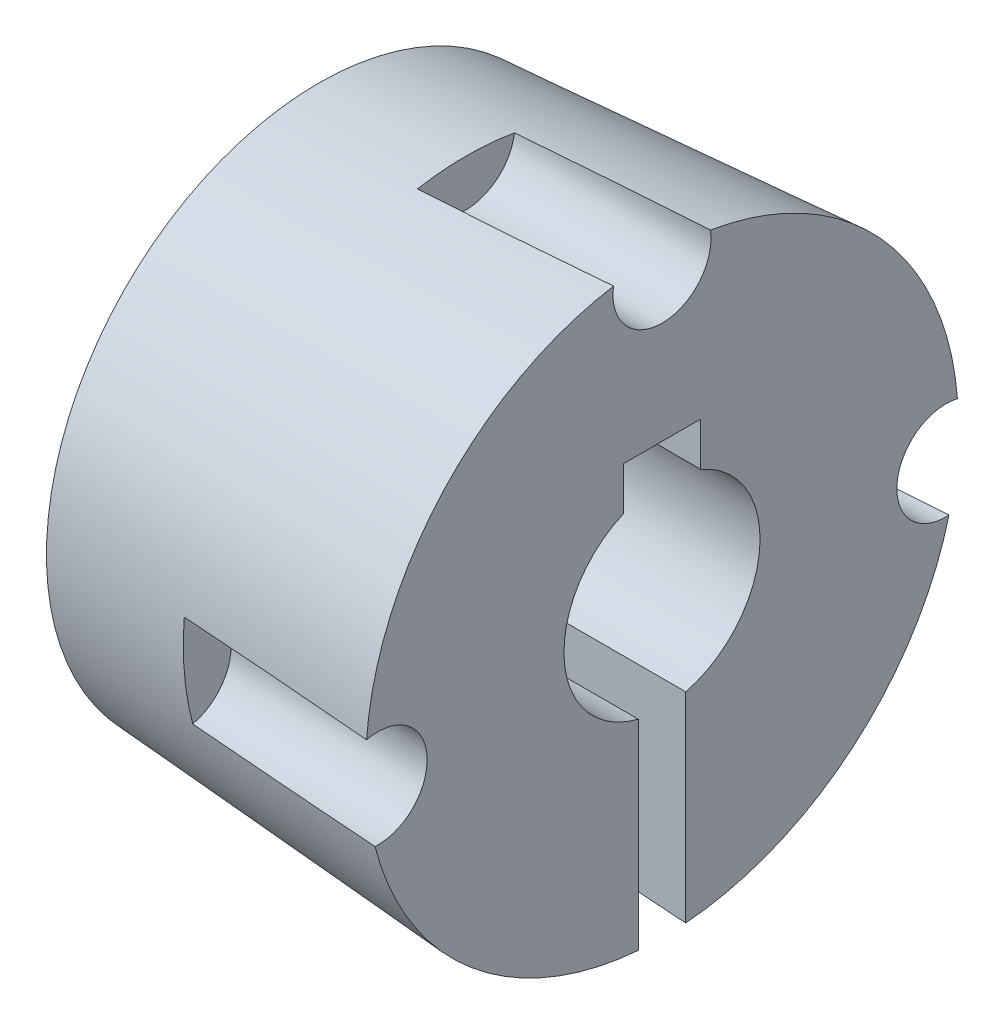
ISO-10303-21;
HEADER;
FILE_DESCRIPTION(('STEP AP214'),'2;1');
FILE_NAME('part.step','',(''),(''),'','','');
FILE_SCHEMA(('AUTOMOTIVE_DESIGN { 1 0 10303 214 1 1 1 1 }'));
ENDSEC;
DATA;
#1=APPLICATION_CONTEXT('core data for automotive mechanical design processes');
#2=APPLICATION_PROTOCOL_DEFINITION('international standard','automotive_design',2000,#1);
#3=PRODUCT_CONTEXT('',#1,'mechanical');
#4=PRODUCT('Part','Part','',(#3));
#5=PRODUCT_RELATED_PRODUCT_CATEGORY('part','',(#4));
#6=PRODUCT_DEFINITION_FORMATION('','',#4);
#7=PRODUCT_DEFINITION_CONTEXT('part definition',#1,'design');
#8=PRODUCT_DEFINITION('design','',#6,#7);
#9=PRODUCT_DEFINITION_SHAPE('','',#8);
#10=(LENGTH_UNIT() NAMED_UNIT(*) SI_UNIT(.MILLI.,.METRE.));
#11=(NAMED_UNIT(*) PLANE_ANGLE_UNIT() SI_UNIT($,.RADIAN.));
#12=(NAMED_UNIT(*) SI_UNIT($,.STERADIAN.) SOLID_ANGLE_UNIT());
#13=UNCERTAINTY_MEASURE_WITH_UNIT(LENGTH_MEASURE(1.E-05),#10,'distance_accuracy_value','');
#14=(GEOMETRIC_REPRESENTATION_CONTEXT(3) GLOBAL_UNCERTAINTY_ASSIGNED_CONTEXT((#13)) GLOBAL_UNIT_ASSIGNED_CONTEXT((#10,
#11,#12)) REPRESENTATION_CONTEXT('',''));
#15=CARTESIAN_POINT('',(0.,0.,0.));
#16=DIRECTION('',(0.,0.,1.));
#17=DIRECTION('',(1.,0.,0.));
#18=AXIS2_PLACEMENT_3D('',#15,#16,#17);
#19=CARTESIAN_POINT('',(22.225,9.59485,0.));
#20=DIRECTION('',(1.,0.,0.));
#21=DIRECTION('',(0.,-1.,0.));
#22=AXIS2_PLACEMENT_3D('',#19,#20,#21);
#23=PLANE('',#22);
#24=DIRECTION('',(0.,1.,0.));
#25=VECTOR('',#24,1.);
#26=CARTESIAN_POINT('',(22.225,-0.959485,1.535176));
#27=LINE('',#26,#25);
#28=CARTESIAN_POINT('',(22.225,-19.1281943930687,1.535176));
#29=VERTEX_POINT('',#28);
#30=CARTESIAN_POINT('',(22.225,-6.16163408918641,1.535176));
#31=VERTEX_POINT('',#30);
#32=EDGE_CURVE('E331',#29,#31,#27,.T.);
#33=ORIENTED_EDGE('',*,*,#32,.T.);
#34=CARTESIAN_POINT('',(22.225,0.,0.));
#35=DIRECTION('',(-1.,0.,0.));
#36=DIRECTION('',(0.,0.,-1.));
#37=AXIS2_PLACEMENT_3D('',#34,#35,#36);
#38=CIRCLE('',#37,6.35);
#39=CARTESIAN_POINT('',(22.225,5.83716540796987,2.5));
#40=VERTEX_POINT('',#39);
#41=EDGE_CURVE('E115',#31,#40,#38,.T.);
#42=ORIENTED_EDGE('',*,*,#41,.T.);
#43=DIRECTION('',(0.,1.,0.));
#44=VECTOR('',#43,1.);
#45=CARTESIAN_POINT('',(22.225,6.959925,2.5));
#46=LINE('',#45,#44);
#47=CARTESIAN_POINT('',(22.225,8.65,2.5));
#48=VERTEX_POINT('',#47);
#49=EDGE_CURVE('E310',#40,#48,#46,.T.);
#50=ORIENTED_EDGE('',*,*,#49,.T.);
#51=DIRECTION('',(0.,0.,-1.));
#52=VECTOR('',#51,1.);
#53=CARTESIAN_POINT('',(22.225,8.65,0.));
#54=LINE('',#53,#52);
#55=CARTESIAN_POINT('',(22.225,8.65,-2.5));
#56=VERTEX_POINT('',#55);
#57=EDGE_CURVE('E11',#48,#56,#54,.T.);
#58=ORIENTED_EDGE('',*,*,#57,.T.);
#59=DIRECTION('',(0.,-1.,0.));
#60=VECTOR('',#59,1.);
#61=CARTESIAN_POINT('',(22.225,6.959925,-2.5));
#62=LINE('',#61,#60);
#63=CARTESIAN_POINT('',(22.225,5.83716540796987,-2.5));
#64=VERTEX_POINT('',#63);
#65=EDGE_CURVE('E313',#56,#64,#62,.T.);
#66=ORIENTED_EDGE('',*,*,#65,.T.);
#67=CARTESIAN_POINT('',(22.225,0.,0.));
#68=DIRECTION('',(-1.,0.,0.));
#69=DIRECTION('',(0.,0.,-1.));
#70=AXIS2_PLACEMENT_3D('',#67,#68,#69);
#71=CIRCLE('',#70,6.35);
#72=CARTESIAN_POINT('',(22.225,-6.16163408918641,-1.535176));
#73=VERTEX_POINT('',#72);
#74=EDGE_CURVE('E75',#64,#73,#71,.T.);
#75=ORIENTED_EDGE('',*,*,#74,.T.);
#76=DIRECTION('',(0.,-1.,0.));
#77=VECTOR('',#76,1.);
#78=CARTESIAN_POINT('',(22.225,-0.959485,-1.535176));
#79=LINE('',#78,#77);
#80=CARTESIAN_POINT('',(22.225,-19.1281943930687,-1.535176));
#81=VERTEX_POINT('',#80);
#82=EDGE_CURVE('E330',#73,#81,#79,.T.);
#83=ORIENTED_EDGE('',*,*,#82,.T.);
#84=CARTESIAN_POINT('',(22.225,0.,0.));
#85=DIRECTION('',(-1.,0.,0.));
#86=DIRECTION('',(0.,1.,0.));
#87=AXIS2_PLACEMENT_3D('',#84,#85,#86);
#88=CIRCLE('',#87,19.1897);
#89=CARTESIAN_POINT('',(22.225,-4.77681167054719,-18.5856572752788));
#90=VERTEX_POINT('',#89);
#91=EDGE_CURVE('E257',#90,#81,#88,.T.);
#92=ORIENTED_EDGE('',*,*,#91,.F.);
#93=CARTESIAN_POINT('',(22.225,-1.60829363649681,-18.3828803833568));
#94=DIRECTION('',(-1.,0.,0.));
#95=DIRECTION('',(0.,-0.996194698091746,0.0871557427476582));
#96=AXIS2_PLACEMENT_3D('',#93,#94,#95);
#97=CIRCLE('',#96,3.175);
#98=CARTESIAN_POINT('',(22.225,1.47687565123978,-19.1327840211709));
#99=VERTEX_POINT('',#98);
#100=EDGE_CURVE('E157',#90,#99,#97,.T.);
#101=ORIENTED_EDGE('',*,*,#100,.T.);
#102=CARTESIAN_POINT('',(22.225,0.,0.));
#103=DIRECTION('',(-1.,0.,0.));
#104=DIRECTION('',(0.,1.,0.));
#105=AXIS2_PLACEMENT_3D('',#102,#103,#104);
#106=CIRCLE('',#105,19.1897);
#107=CARTESIAN_POINT('',(22.225,18.9312598072953,-3.13878769570155));
#108=VERTEX_POINT('',#107);
#109=EDGE_CURVE('E152',#108,#99,#106,.T.);
#110=ORIENTED_EDGE('',*,*,#109,.F.);
#111=CARTESIAN_POINT('',(22.225,18.4531,0.));
#112=DIRECTION('',(-1.,0.,0.));
#113=DIRECTION('',(0.,0.,-1.));
#114=AXIS2_PLACEMENT_3D('',#111,#112,#113);
#115=CIRCLE('',#114,3.175);
#116=CARTESIAN_POINT('',(22.225,18.9312598072953,3.13878769570155));
#117=VERTEX_POINT('',#116);
#118=EDGE_CURVE('E295',#108,#117,#115,.T.);
#119=ORIENTED_EDGE('',*,*,#118,.T.);
#120=CARTESIAN_POINT('',(22.225,0.,0.));
#121=DIRECTION('',(-1.,0.,0.));
#122=DIRECTION('',(0.,1.,0.));
#123=AXIS2_PLACEMENT_3D('',#120,#121,#122);
#124=CIRCLE('',#123,19.1897);
#125=CARTESIAN_POINT('',(22.225,1.47687565123978,19.1327840211709));
#126=VERTEX_POINT('',#125);
#127=EDGE_CURVE('E286',#126,#117,#124,.T.);
#128=ORIENTED_EDGE('',*,*,#127,.F.);
#129=CARTESIAN_POINT('',(22.225,-1.60829363649681,18.3828803833568));
#130=DIRECTION('',(-1.,0.,0.));
#131=DIRECTION('',(0.,0.996194698091746,0.0871557427476582));
#132=AXIS2_PLACEMENT_3D('',#129,#130,#131);
#133=CIRCLE('',#132,3.175);
#134=CARTESIAN_POINT('',(22.225,-4.77681167054719,18.5856572752788));
#135=VERTEX_POINT('',#134);
#136=EDGE_CURVE('E102',#126,#135,#133,.T.);
#137=ORIENTED_EDGE('',*,*,#136,.T.);
#138=CARTESIAN_POINT('',(22.225,0.,0.));
#139=DIRECTION('',(-1.,0.,0.));
#140=DIRECTION('',(0.,1.,0.));
#141=AXIS2_PLACEMENT_3D('',#138,#139,#140);
#142=CIRCLE('',#141,19.1897);
#143=EDGE_CURVE('E241',#29,#135,#142,.T.);
#144=ORIENTED_EDGE('',*,*,#143,.F.);
#145=EDGE_LOOP('',(#33,#42,#50,#58,#66,#75,#83,#92,#101,#110,#119,#128,#137,#144));
#146=FACE_BOUND('',#145,.T.);
#147=ADVANCED_FACE('F17',(#146),#23,.T.);
#148=CARTESIAN_POINT('',(11.1125,8.65,0.));
#149=DIRECTION('',(0.,-1.,0.));
#150=DIRECTION('',(0.,0.,-1.));
#151=AXIS2_PLACEMENT_3D('',#148,#149,#150);
#152=PLANE('',#151);
#153=DIRECTION('',(0.,0.,1.));
#154=VECTOR('',#153,1.);
#155=CARTESIAN_POINT('',(0.,8.65,0.));
#156=LINE('',#155,#154);
#157=CARTESIAN_POINT('',(0.,8.65,-2.5));
#158=VERTEX_POINT('',#157);
#159=CARTESIAN_POINT('',(0.,8.65,2.5));
#160=VERTEX_POINT('',#159);
#161=EDGE_CURVE('E323',#158,#160,#156,.T.);
#162=ORIENTED_EDGE('',*,*,#161,.F.);
#163=DIRECTION('',(1.,0.,0.));
#164=VECTOR('',#163,1.);
#165=CARTESIAN_POINT('',(11.1125,8.65,-2.5));
#166=LINE('',#165,#164);
#167=EDGE_CURVE('E31',#158,#56,#166,.T.);
#168=ORIENTED_EDGE('',*,*,#167,.T.);
#169=ORIENTED_EDGE('',*,*,#57,.F.);
#170=DIRECTION('',(-1.,0.,0.));
#171=VECTOR('',#170,1.);
#172=CARTESIAN_POINT('',(11.1125,8.65,2.5));
#173=LINE('',#172,#171);
#174=EDGE_CURVE('E298',#48,#160,#173,.T.);
#175=ORIENTED_EDGE('',*,*,#174,.T.);
#176=EDGE_LOOP('',(#162,#168,#169,#175));
#177=FACE_BOUND('',#176,.T.);
#178=ADVANCED_FACE('F398',(#177),#152,.T.);
#179=CARTESIAN_POINT('',(11.1125,4.325,-2.5));
#180=DIRECTION('',(0.,0.,1.));
#181=DIRECTION('',(1.,0.,0.));
#182=AXIS2_PLACEMENT_3D('',#179,#180,#181);
#183=PLANE('',#182);
#184=DIRECTION('',(0.,1.,0.));
#185=VECTOR('',#184,1.);
#186=CARTESIAN_POINT('',(0.,6.57202557374426,-2.5));
#187=LINE('',#186,#185);
#188=CARTESIAN_POINT('',(0.,5.83716540796987,-2.5));
#189=VERTEX_POINT('',#188);
#190=EDGE_CURVE('E319',#189,#158,#187,.T.);
#191=ORIENTED_EDGE('',*,*,#190,.F.);
#192=DIRECTION('',(-1.,0.,0.));
#193=VECTOR('',#192,1.);
#194=CARTESIAN_POINT('',(11.1125,5.83716540796987,-2.5));
#195=LINE('',#194,#193);
#196=EDGE_CURVE('E348',#64,#189,#195,.T.);
#197=ORIENTED_EDGE('',*,*,#196,.F.);
#198=ORIENTED_EDGE('',*,*,#65,.F.);
#199=ORIENTED_EDGE('',*,*,#167,.F.);
#200=EDGE_LOOP('',(#191,#197,#198,#199));
#201=FACE_BOUND('',#200,.T.);
#202=ADVANCED_FACE('F395',(#201),#183,.T.);
#203=CARTESIAN_POINT('',(11.1125,4.325,2.5));
#204=DIRECTION('',(0.,0.,1.));
#205=DIRECTION('',(1.,0.,0.));
#206=AXIS2_PLACEMENT_3D('',#203,#204,#205);
#207=PLANE('',#206);
#208=DIRECTION('',(0.,-1.,0.));
#209=VECTOR('',#208,1.);
#210=CARTESIAN_POINT('',(0.,6.57202557374426,2.5));
#211=LINE('',#210,#209);
#212=CARTESIAN_POINT('',(0.,5.83716540796987,2.5));
#213=VERTEX_POINT('',#212);
#214=EDGE_CURVE('E345',#160,#213,#211,.T.);
#215=ORIENTED_EDGE('',*,*,#214,.F.);
#216=ORIENTED_EDGE('',*,*,#174,.F.);
#217=ORIENTED_EDGE('',*,*,#49,.F.);
#218=DIRECTION('',(1.,0.,0.));
#219=VECTOR('',#218,1.);
#220=CARTESIAN_POINT('',(11.1125,5.83716540796987,2.5));
#221=LINE('',#220,#219);
#222=EDGE_CURVE('E173',#213,#40,#221,.T.);
#223=ORIENTED_EDGE('',*,*,#222,.F.);
#224=EDGE_LOOP('',(#215,#216,#217,#223));
#225=FACE_BOUND('',#224,.T.);
#226=ADVANCED_FACE('F403',(#225),#207,.F.);
#227=CARTESIAN_POINT('',(16.375,18.4531,0.));
#228=DIRECTION('',(-1.,0.,0.));
#229=DIRECTION('',(0.,0.,-1.));
#230=AXIS2_PLACEMENT_3D('',#227,#228,#229);
#231=CYLINDRICAL_SURFACE('',#230,3.175);
#232=CARTESIAN_POINT('',(22.2249990842214,18.9312663694617,3.13874772556863));
#233=CARTESIAN_POINT('',(21.6965128717116,18.8929039142587,3.14455795965913));
#234=CARTESIAN_POINT('',(21.1680111110432,18.8546480942142,3.14965156892552));
#235=CARTESIAN_POINT('',(20.110817453753,18.7783407807485,3.15843144485977));
#236=CARTESIAN_POINT('',(19.5821255487172,18.7402893539092,3.1621172774578));
#237=CARTESIAN_POINT('',(18.5245516279835,18.6643935701948,3.16810490022839));
#238=CARTESIAN_POINT('',(17.995669604871,18.6265492823395,3.1704062539587));
#239=CARTESIAN_POINT('',(16.9377154395597,18.5510693455787,3.17364806457086));
#240=CARTESIAN_POINT('',(16.4086432909538,18.5134337677394,3.17458808323553));
#241=CARTESIAN_POINT('',(15.3503088758068,18.4383720006973,3.17513025511628));
#242=CARTESIAN_POINT('',(14.8210466038835,18.4009458843075,3.17473196892807));
#243=CARTESIAN_POINT('',(13.7623319385705,18.3263028869355,3.17262043290532));
#244=CARTESIAN_POINT('',(13.2328795408319,18.2890860801693,3.17090674304027));
#245=CARTESIAN_POINT('',(12.1737846294268,18.2148607661589,3.16618718775157));
#246=CARTESIAN_POINT('',(11.6441421124536,18.1778523342146,3.1631808822157));
#247=CARTESIAN_POINT('',(10.5846669364506,18.104041794008,3.15589872208468));
#248=CARTESIAN_POINT('',(10.0548342751476,18.0672397617076,3.15162242780242));
#249=CARTESIAN_POINT('',(9.52499991031494,18.0305463707409,3.14672354499309));
#250=B_SPLINE_CURVE_WITH_KNOTS('',3,(#232,#233,#234,#235,#236,#237,#238,#239,#240,#241,#242,
#243,#244,#245,#246,#247,#248,#249),.UNSPECIFIED.,.F.,.F.,(4,2,2,2,2,2,2,2,4),(0.,
1.5897251702087,3.17994011676524,4.77065609934622,6.36188402365459,7.95363444524772,
9.54591757338986,11.1387432749278,12.7321210781888),.UNSPECIFIED.);
#251=CARTESIAN_POINT('',(9.525,18.0305408396218,3.14675527424369));
#252=VERTEX_POINT('',#251);
#253=EDGE_CURVE('E283',#117,#252,#250,.T.);
#254=ORIENTED_EDGE('',*,*,#253,.F.);
#255=ORIENTED_EDGE('',*,*,#118,.F.);
#256=CARTESIAN_POINT('',(9.52499991031494,18.0305463707409,-3.14672354499308));
#257=CARTESIAN_POINT('',(10.0548342751476,18.0672397617076,-3.15162242780242));
#258=CARTESIAN_POINT('',(10.5846669364506,18.104041794008,-3.15589872208468));
#259=CARTESIAN_POINT('',(11.6441421124535,18.1778523342145,-3.16318088221571));
#260=CARTESIAN_POINT('',(12.1737846294267,18.2148607661589,-3.16618718775157));
#261=CARTESIAN_POINT('',(13.2328795408318,18.2890860801693,-3.17090674304027));
#262=CARTESIAN_POINT('',(13.7623319385704,18.3263028869355,-3.17262043290533));
#263=CARTESIAN_POINT('',(14.8210466038834,18.4009458843075,-3.17473196892808));
#264=CARTESIAN_POINT('',(15.3503088758067,18.4383720006973,-3.17513025511628));
#265=CARTESIAN_POINT('',(16.4086432909537,18.5134337677394,-3.17458808323554));
#266=CARTESIAN_POINT('',(16.9377154395596,18.5510693455787,-3.17364806457086));
#267=CARTESIAN_POINT('',(17.9956696048709,18.6265492823395,-3.1704062539587));
#268=CARTESIAN_POINT('',(18.5245516279834,18.6643935701948,-3.16810490022839));
#269=CARTESIAN_POINT('',(19.5821255487171,18.7402893539092,-3.16211727745779));
#270=CARTESIAN_POINT('',(20.110817453753,18.7783407807485,-3.15843144485975));
#271=CARTESIAN_POINT('',(21.1680111110432,18.8546480942142,-3.14965156892549));
#272=CARTESIAN_POINT('',(21.6965128717116,18.8929039142587,-3.14455795965909));
#273=CARTESIAN_POINT('',(22.2249990842214,18.9312663694617,-3.1387477255686));
#274=B_SPLINE_CURVE_WITH_KNOTS('',3,(#256,#257,#258,#259,#260,#261,#262,#263,#264,#265,#266,
#267,#268,#269,#270,#271,#272,#273),.UNSPECIFIED.,.F.,.F.,(4,2,2,2,2,2,2,2,4),(0.,
1.59337780326089,3.18620350479883,4.77848663294095,6.37023705453407,7.96146497884245,
9.55218096142345,11.14239590798,12.7321210781888),.UNSPECIFIED.);
#275=CARTESIAN_POINT('',(9.525,18.0305408396218,-3.14675527424369));
#276=VERTEX_POINT('',#275);
#277=EDGE_CURVE('E274',#276,#108,#274,.T.);
#278=ORIENTED_EDGE('',*,*,#277,.F.);
#279=CARTESIAN_POINT('',(9.525,18.4531,0.));
#280=DIRECTION('',(-1.,0.,0.));
#281=DIRECTION('',(0.,0.,-1.));
#282=AXIS2_PLACEMENT_3D('',#279,#280,#281);
#283=CIRCLE('',#282,3.175);
#284=EDGE_CURVE('E293',#276,#252,#283,.T.);
#285=ORIENTED_EDGE('',*,*,#284,.T.);
#286=EDGE_LOOP('',(#254,#255,#278,#285));
#287=FACE_BOUND('',#286,.T.);
#288=ADVANCED_FACE('F427',(#287),#231,.F.);
#289=CARTESIAN_POINT('',(9.525,18.4531,0.));
#290=DIRECTION('',(-1.,0.,0.));
#291=DIRECTION('',(0.,0.,1.));
#292=AXIS2_PLACEMENT_3D('',#289,#290,#291);
#293=PLANE('',#292);
#294=CARTESIAN_POINT('',(9.525,0.,0.));
#295=DIRECTION('',(-1.,0.,0.));
#296=DIRECTION('',(0.,1.,0.));
#297=AXIS2_PLACEMENT_3D('',#294,#295,#296);
#298=CIRCLE('',#297,18.3030727399869);
#299=EDGE_CURVE('E277',#252,#276,#298,.T.);
#300=ORIENTED_EDGE('',*,*,#299,.F.);
#301=ORIENTED_EDGE('',*,*,#284,.F.);
#302=EDGE_LOOP('',(#300,#301));
#303=FACE_BOUND('',#302,.T.);
#304=ADVANCED_FACE('F448',(#303),#293,.F.);
#305=CARTESIAN_POINT('',(16.375,-1.60829363649681,18.3828803833568));
#306=DIRECTION('',(-1.,0.,0.));
#307=DIRECTION('',(0.,0.996194698091746,0.0871557427476582));
#308=AXIS2_PLACEMENT_3D('',#305,#306,#307);
#309=CYLINDRICAL_SURFACE('',#308,3.175);
#310=CARTESIAN_POINT('',(22.224999083807,-4.77677240666845,18.5856673006393));
#311=CARTESIAN_POINT('',(21.6965126218974,-4.77921701984449,18.5469444136844));
#312=CARTESIAN_POINT('',(21.168010611849,-4.78095702968703,18.5083902139069));
#313=CARTESIAN_POINT('',(20.1108165270524,-4.78305287102237,18.431608026402));
#314=CARTESIAN_POINT('',(19.5821244438938,-4.78340827608722,18.3933801427891));
#315=CARTESIAN_POINT('',(18.5245502381681,-4.78275835851104,18.3172512897642));
#316=CARTESIAN_POINT('',(17.9956681081893,-4.7817526072878,18.2793504271021));
#317=CARTESIAN_POINT('',(16.9377138003996,-4.77840357141758,18.2038751617185));
#318=CARTESIAN_POINT('',(16.4086416161842,-4.77605985659523,18.1663008679402));
#319=CARTESIAN_POINT('',(15.3503072010726,-4.77005790265254,18.0914774798347));
#320=CARTESIAN_POINT('',(14.8210449647963,-4.76639923232316,18.0542284962944));
#321=CARTESIAN_POINT('',(13.7623304420325,-4.75779016868792,17.9800535799917));
#322=CARTESIAN_POINT('',(13.2328781511978,-4.75283934366817,17.9431277594688));
#323=CARTESIAN_POINT('',(12.1737835248556,-4.74166859047176,17.8695962507612));
#324=CARTESIAN_POINT('',(11.6441411860428,-4.73544823059099,17.8329906759032));
#325=CARTESIAN_POINT('',(10.5846664376171,-4.72176077587834,17.7600957181726));
#326=CARTESIAN_POINT('',(10.0548340257317,-4.71429324982028,17.7238064492497));
#327=CARTESIAN_POINT('',(9.52499991031484,-4.70621497294034,17.6876796704521));
#328=B_SPLINE_CURVE_WITH_KNOTS('',3,(#310,#311,#312,#313,#314,#315,#316,#317,#318,#319,#320,
#321,#322,#323,#324,#325,#326,#327),.UNSPECIFIED.,.F.,.F.,(4,2,2,2,2,2,2,2,4),(0.,
1.58972592013486,3.17994140236498,4.7706577063495,6.36188573777791,7.95363605219798,
9.54591885886816,11.1387440246332,12.7321210778216),.UNSPECIFIED.);
#329=CARTESIAN_POINT('',(9.525,-4.70624609941303,17.6876713949862));
#330=VERTEX_POINT('',#329);
#331=EDGE_CURVE('E229',#135,#330,#328,.T.);
#332=ORIENTED_EDGE('',*,*,#331,.F.);
#333=ORIENTED_EDGE('',*,*,#136,.F.);
#334=CARTESIAN_POINT('',(9.52499991031484,1.56328365076338,18.2361897260175));
#335=CARTESIAN_POINT('',(10.0548340257317,1.56496585116255,18.2731704359277));
#336=CARTESIAN_POINT('',(10.5846664376171,1.56601836330302,18.3102051116057));
#337=CARTESIAN_POINT('',(11.6441411860428,1.56683979825201,18.3843694327021));
#338=CARTESIAN_POINT('',(12.1737835248557,1.56660916552258,18.4214990407834));
#339=CARTESIAN_POINT('',(13.2328781511979,1.56484159738921,18.4958532215851));
#340=CARTESIAN_POINT('',(13.7623304420326,1.56330510680982,18.533077757665));
#341=CARTESIAN_POINT('',(14.8210449647964,1.55890304037942,18.6076207385307));
#342=CARTESIAN_POINT('',(15.3503072010726,1.55603790917379,18.6449391477483));
#343=CARTESIAN_POINT('',(16.4086416161842,1.54895573495838,18.7196680288259));
#344=CARTESIAN_POINT('',(16.9377138003996,1.54473913584455,18.7570784664606));
#345=CARTESIAN_POINT('',(17.9956681081893,1.53493115004186,18.8319886469468));
#346=CARTESIAN_POINT('',(18.5245502381681,1.52934020591084,18.8694883572094));
#347=CARTESIAN_POINT('',(19.5821244438939,1.51676061318303,18.944573498899));
#348=CARTESIAN_POINT('',(20.1108165270524,1.50977240519426,18.9821588996204));
#349=CARTESIAN_POINT('',(21.168010611849,1.49437531746062,19.0574106541399));
#350=CARTESIAN_POINT('',(21.6965126218974,1.48596687574461,19.0950769794536));
#351=CARTESIAN_POINT('',(22.224999083807,1.476835242982,19.1327870761227));
#352=B_SPLINE_CURVE_WITH_KNOTS('',3,(#334,#335,#336,#337,#338,#339,#340,#341,#342,#343,#344,
#345,#346,#347,#348,#349,#350,#351),.UNSPECIFIED.,.F.,.F.,(4,2,2,2,2,2,2,2,4),(0.,
1.59337705318845,3.18620221895346,4.77848502562364,6.37023534004371,7.96146337147212,
9.55217967545664,11.1423951576867,12.7321210778216),.UNSPECIFIED.);
#353=CARTESIAN_POINT('',(9.525,1.56331574137458,18.2361869813297));
#354=VERTEX_POINT('',#353);
#355=EDGE_CURVE('E262',#354,#126,#352,.T.);
#356=ORIENTED_EDGE('',*,*,#355,.F.);
#357=CARTESIAN_POINT('',(9.525,-1.60829363649681,18.3828803833568));
#358=DIRECTION('',(-1.,0.,0.));
#359=DIRECTION('',(0.,0.996194698091746,0.0871557427476582));
#360=AXIS2_PLACEMENT_3D('',#357,#358,#359);
#361=CIRCLE('',#360,3.175);
#362=EDGE_CURVE('E91',#354,#330,#361,.T.);
#363=ORIENTED_EDGE('',*,*,#362,.T.);
#364=EDGE_LOOP('',(#332,#333,#356,#363));
#365=FACE_BOUND('',#364,.T.);
#366=ADVANCED_FACE('F19',(#365),#309,.F.);
#367=CARTESIAN_POINT('',(9.525,-1.60829363649681,18.3828803833568));
#368=DIRECTION('',(-1.,0.,0.));
#369=DIRECTION('',(0.,-0.996194698091746,-0.0871557427476582));
#370=AXIS2_PLACEMENT_3D('',#367,#368,#369);
#371=PLANE('',#370);
#372=CARTESIAN_POINT('',(9.525,0.,0.));
#373=DIRECTION('',(-1.,0.,0.));
#374=DIRECTION('',(0.,1.,0.));
#375=AXIS2_PLACEMENT_3D('',#372,#373,#374);
#376=CIRCLE('',#375,18.3030727399869);
#377=EDGE_CURVE('E240',#330,#354,#376,.T.);
#378=ORIENTED_EDGE('',*,*,#377,.F.);
#379=ORIENTED_EDGE('',*,*,#362,.F.);
#380=EDGE_LOOP('',(#378,#379));
#381=FACE_BOUND('',#380,.T.);
#382=ADVANCED_FACE('F193',(#381),#371,.F.);
#383=CARTESIAN_POINT('',(11.1125,0.,0.));
#384=DIRECTION('',(1.,0.,0.));
#385=DIRECTION('',(0.,1.,0.));
#386=AXIS2_PLACEMENT_3D('',#383,#384,#385);
#387=CONICAL_SURFACE('',#386,18.4139011474885,0.0697000802996132);
#388=CARTESIAN_POINT('',(0.,-17.5711663590411,1.535176));
#389=CARTESIAN_POINT('',(10.641160729511,-18.3168895142304,1.535176));
#390=CARTESIAN_POINT('',(22.2252706108045,-19.1282133460135,1.535176));
#391=(BOUNDED_CURVE() B_SPLINE_CURVE(2,(#388,#389,#390),.UNSPECIFIED.,.F.,
.F.) B_SPLINE_CURVE_WITH_KNOTS((3,3),(0.,22.2797452655061),
.UNSPECIFIED.) CURVE() GEOMETRIC_REPRESENTATION_ITEM() RATIONAL_B_SPLINE_CURVE((1.,
1.00089494617182,1.)) REPRESENTATION_ITEM(''));
#392=CARTESIAN_POINT('',(0.,-17.5711663590411,1.535176));
#393=VERTEX_POINT('',#392);
#394=EDGE_CURVE('E244',#393,#29,#391,.T.);
#395=ORIENTED_EDGE('',*,*,#394,.T.);
#396=ORIENTED_EDGE('',*,*,#143,.T.);
#397=ORIENTED_EDGE('',*,*,#331,.T.);
#398=ORIENTED_EDGE('',*,*,#377,.T.);
#399=ORIENTED_EDGE('',*,*,#355,.T.);
#400=ORIENTED_EDGE('',*,*,#127,.T.);
#401=ORIENTED_EDGE('',*,*,#253,.T.);
#402=ORIENTED_EDGE('',*,*,#299,.T.);
#403=ORIENTED_EDGE('',*,*,#277,.T.);
#404=ORIENTED_EDGE('',*,*,#109,.T.);
#405=CARTESIAN_POINT('',(22.224999083807,1.47683524298161,-19.1327870761228));
#406=CARTESIAN_POINT('',(21.6965126218914,1.48596687574423,-19.0950769794532));
#407=CARTESIAN_POINT('',(21.1680106118368,1.49437531746026,-19.0574106541391));
#408=CARTESIAN_POINT('',(20.1108165270298,1.50977240519392,-18.9821588996188));
#409=CARTESIAN_POINT('',(19.5821244438669,1.5167606131827,-18.9445734988971));
#410=CARTESIAN_POINT('',(18.5245502381343,1.52934020591055,-18.8694883572071));
#411=CARTESIAN_POINT('',(17.9956681081529,1.53493115004159,-18.8319886469443));
#412=CARTESIAN_POINT('',(16.9377138003597,1.54473913584431,-18.7570784664578));
#413=CARTESIAN_POINT('',(16.4086416161434,1.54895573495815,-18.719668028823));
#414=CARTESIAN_POINT('',(15.3503072010318,1.55603790917359,-18.6449391477455));
#415=CARTESIAN_POINT('',(14.8210449647564,1.55890304037922,-18.6076207385279));
#416=CARTESIAN_POINT('',(13.7623304419961,1.56330510680966,-18.5330777576625));
#417=CARTESIAN_POINT('',(13.232878151164,1.56484159738907,-18.4958532215827));
#418=CARTESIAN_POINT('',(12.1737835248287,1.56660916552247,-18.4214990407815));
#419=CARTESIAN_POINT('',(11.6441411860202,1.56683979825192,-18.3843694327005));
#420=CARTESIAN_POINT('',(10.5846664376049,1.56601836330295,-18.3102051116049));
#421=CARTESIAN_POINT('',(10.0548340257256,1.5649658511625,-18.2731704359273));
#422=CARTESIAN_POINT('',(9.52499991031484,1.56328365076337,-18.2361897260175));
#423=B_SPLINE_CURVE_WITH_KNOTS('',3,(#405,#406,#407,#408,#409,#410,#411,#412,#413,#414,#415,
#416,#417,#418,#419,#420,#421,#422),.UNSPECIFIED.,.F.,.F.,(4,2,2,2,2,2,2,2,4),(0.,
1.58972592015313,3.17994140239629,4.77065770638865,6.36188573781966,7.95363605223712,
9.54591885889948,11.1387440246514,12.7321210778216),.UNSPECIFIED.);
#424=CARTESIAN_POINT('',(9.525,1.56331574137458,-18.2361869813297));
#425=VERTEX_POINT('',#424);
#426=EDGE_CURVE('E142',#99,#425,#423,.T.);
#427=ORIENTED_EDGE('',*,*,#426,.T.);
#428=CARTESIAN_POINT('',(9.525,0.,0.));
#429=DIRECTION('',(-1.,0.,0.));
#430=DIRECTION('',(0.,1.,0.));
#431=AXIS2_PLACEMENT_3D('',#428,#429,#430);
#432=CIRCLE('',#431,18.3030727399869);
#433=CARTESIAN_POINT('',(9.525,-4.70624609941303,-17.6876713949862));
#434=VERTEX_POINT('',#433);
#435=EDGE_CURVE('E149',#425,#434,#432,.T.);
#436=ORIENTED_EDGE('',*,*,#435,.T.);
#437=CARTESIAN_POINT('',(9.52499991031484,-4.70621497294038,-17.6876796704521));
#438=CARTESIAN_POINT('',(10.0548340257256,-4.71429324982022,-17.7238064492493));
#439=CARTESIAN_POINT('',(10.5846664376048,-4.72176077587817,-17.7600957181717));
#440=CARTESIAN_POINT('',(11.6441411860201,-4.73544823059067,-17.8329906759017));
#441=CARTESIAN_POINT('',(12.1737835248285,-4.74166859047136,-17.8695962507593));
#442=CARTESIAN_POINT('',(13.2328781511637,-4.75283934366764,-17.9431277594665));
#443=CARTESIAN_POINT('',(13.7623304419958,-4.75779016868733,-17.9800535799892));
#444=CARTESIAN_POINT('',(14.8210449647561,-4.76639923232249,-18.0542284962917));
#445=CARTESIAN_POINT('',(15.3503072010315,-4.77005790265185,-18.0914774798319));
#446=CARTESIAN_POINT('',(16.4086416161431,-4.7760598565945,-18.1663008679374));
#447=CARTESIAN_POINT('',(16.9377138003593,-4.77840357141683,-18.2038751617158));
#448=CARTESIAN_POINT('',(17.9956681081526,-4.78175260728704,-18.2793504270997));
#449=CARTESIAN_POINT('',(18.524550238134,-4.78275835851029,-18.317251289762));
#450=CARTESIAN_POINT('',(19.5821244438667,-4.78340827608652,-18.3933801427874));
#451=CARTESIAN_POINT('',(20.1108165270296,-4.78305287102172,-18.4316080264006));
#452=CARTESIAN_POINT('',(21.1680106118367,-4.78095702968649,-18.5083902139062));
#453=CARTESIAN_POINT('',(21.6965126218913,-4.77921701984401,-18.5469444136841));
#454=CARTESIAN_POINT('',(22.224999083807,-4.77677240666801,-18.5856673006394));
#455=B_SPLINE_CURVE_WITH_KNOTS('',3,(#437,#438,#439,#440,#441,#442,#443,#444,#445,#446,#447,
#448,#449,#450,#451,#452,#453,#454),.UNSPECIFIED.,.F.,.F.,(4,2,2,2,2,2,2,2,4),(0.,
1.59337705317002,3.18620221892187,4.77848502558416,6.3702353400016,7.96146337143264,
9.55217967542506,11.1423951576683,12.7321210778216),.UNSPECIFIED.);
#456=EDGE_CURVE('E163',#434,#90,#455,.T.);
#457=ORIENTED_EDGE('',*,*,#456,.T.);
#458=ORIENTED_EDGE('',*,*,#91,.T.);
#459=CARTESIAN_POINT('',(22.2252706108045,-19.1282133460135,-1.535176));
#460=CARTESIAN_POINT('',(10.641160729511,-18.3168895142304,-1.535176));
#461=CARTESIAN_POINT('',(0.,-17.5711663590411,-1.535176));
#462=(BOUNDED_CURVE() B_SPLINE_CURVE(2,(#459,#460,#461),.UNSPECIFIED.,.F.,
.F.) B_SPLINE_CURVE_WITH_KNOTS((3,3),(0.,22.2797452655061),
.UNSPECIFIED.) CURVE() GEOMETRIC_REPRESENTATION_ITEM() RATIONAL_B_SPLINE_CURVE((1.,
1.00089494617544,1.)) REPRESENTATION_ITEM(''));
#463=CARTESIAN_POINT('',(0.,-17.5711663590411,-1.535176));
#464=VERTEX_POINT('',#463);
#465=EDGE_CURVE('E324',#81,#464,#462,.T.);
#466=ORIENTED_EDGE('',*,*,#465,.T.);
#467=CARTESIAN_POINT('',(0.,0.,0.));
#468=DIRECTION('',(-1.,0.,0.));
#469=DIRECTION('',(0.,1.,0.));
#470=AXIS2_PLACEMENT_3D('',#467,#468,#469);
#471=CIRCLE('',#470,17.638102294977);
#472=EDGE_CURVE('E317',#393,#464,#471,.T.);
#473=ORIENTED_EDGE('',*,*,#472,.F.);
#474=EDGE_LOOP('',(#395,#396,#397,#398,#399,#400,#401,#402,#403,#404,#427,#436,#457,#458,#466,#473));
#475=FACE_BOUND('',#474,.T.);
#476=ADVANCED_FACE('F146',(#475),#387,.T.);
#477=CARTESIAN_POINT('',(16.375,-1.60829363649681,-18.3828803833568));
#478=DIRECTION('',(-1.,0.,0.));
#479=DIRECTION('',(0.,-0.996194698091746,0.0871557427476582));
#480=AXIS2_PLACEMENT_3D('',#477,#478,#479);
#481=CYLINDRICAL_SURFACE('',#480,3.175);
#482=ORIENTED_EDGE('',*,*,#426,.F.);
#483=ORIENTED_EDGE('',*,*,#100,.F.);
#484=ORIENTED_EDGE('',*,*,#456,.F.);
#485=CARTESIAN_POINT('',(9.525,-1.60829363649681,-18.3828803833568));
#486=DIRECTION('',(-1.,0.,0.));
#487=DIRECTION('',(0.,-0.996194698091746,0.0871557427476582));
#488=AXIS2_PLACEMENT_3D('',#485,#486,#487);
#489=CIRCLE('',#488,3.175);
#490=EDGE_CURVE('E158',#434,#425,#489,.T.);
#491=ORIENTED_EDGE('',*,*,#490,.T.);
#492=EDGE_LOOP('',(#482,#483,#484,#491));
#493=FACE_BOUND('',#492,.T.);
#494=ADVANCED_FACE('F162',(#493),#481,.F.);
#495=CARTESIAN_POINT('',(9.525,-1.60829363649681,-18.3828803833568));
#496=DIRECTION('',(-1.,0.,0.));
#497=DIRECTION('',(0.,0.996194698091746,-0.0871557427476582));
#498=AXIS2_PLACEMENT_3D('',#495,#496,#497);
#499=PLANE('',#498);
#500=ORIENTED_EDGE('',*,*,#435,.F.);
#501=ORIENTED_EDGE('',*,*,#490,.F.);
#502=EDGE_LOOP('',(#500,#501));
#503=FACE_BOUND('',#502,.T.);
#504=ADVANCED_FACE('F168',(#503),#499,.F.);
#505=CARTESIAN_POINT('',(11.1125,0.,0.));
#506=DIRECTION('',(-1.,0.,0.));
#507=DIRECTION('',(0.,0.,-1.));
#508=AXIS2_PLACEMENT_3D('',#505,#506,#507);
#509=CYLINDRICAL_SURFACE('',#508,6.35);
#510=DIRECTION('',(-1.,0.,0.));
#511=VECTOR('',#510,1.);
#512=CARTESIAN_POINT('',(11.1125,-6.16163408918641,1.535176));
#513=LINE('',#512,#511);
#514=CARTESIAN_POINT('',(0.,-6.16163408918641,1.535176));
#515=VERTEX_POINT('',#514);
#516=EDGE_CURVE('E336',#31,#515,#513,.T.);
#517=ORIENTED_EDGE('',*,*,#516,.T.);
#518=CARTESIAN_POINT('',(0.,0.,0.));
#519=DIRECTION('',(1.,0.,0.));
#520=DIRECTION('',(0.,0.,-1.));
#521=AXIS2_PLACEMENT_3D('',#518,#519,#520);
#522=CIRCLE('',#521,6.35);
#523=EDGE_CURVE('E126',#213,#515,#522,.T.);
#524=ORIENTED_EDGE('',*,*,#523,.F.);
#525=ORIENTED_EDGE('',*,*,#222,.T.);
#526=ORIENTED_EDGE('',*,*,#41,.F.);
#527=EDGE_LOOP('',(#517,#524,#525,#526));
#528=FACE_BOUND('',#527,.T.);
#529=ADVANCED_FACE('F381',(#528),#509,.F.);
#530=CARTESIAN_POINT('',(11.1125,0.,0.));
#531=DIRECTION('',(-1.,0.,0.));
#532=DIRECTION('',(0.,0.,-1.));
#533=AXIS2_PLACEMENT_3D('',#530,#531,#532);
#534=CYLINDRICAL_SURFACE('',#533,6.35);
#535=DIRECTION('',(1.,0.,0.));
#536=VECTOR('',#535,1.);
#537=CARTESIAN_POINT('',(11.1125,-6.16163408918641,-1.535176));
#538=LINE('',#537,#536);
#539=CARTESIAN_POINT('',(0.,-6.16163408918641,-1.535176));
#540=VERTEX_POINT('',#539);
#541=EDGE_CURVE('E318',#540,#73,#538,.T.);
#542=ORIENTED_EDGE('',*,*,#541,.T.);
#543=ORIENTED_EDGE('',*,*,#74,.F.);
#544=ORIENTED_EDGE('',*,*,#196,.T.);
#545=CARTESIAN_POINT('',(0.,0.,0.));
#546=DIRECTION('',(1.,0.,0.));
#547=DIRECTION('',(0.,0.,-1.));
#548=AXIS2_PLACEMENT_3D('',#545,#546,#547);
#549=CIRCLE('',#548,6.35);
#550=EDGE_CURVE('E66',#540,#189,#549,.T.);
#551=ORIENTED_EDGE('',*,*,#550,.F.);
#552=EDGE_LOOP('',(#542,#543,#544,#551));
#553=FACE_BOUND('',#552,.T.);
#554=ADVANCED_FACE('F421',(#553),#534,.F.);
#555=CARTESIAN_POINT('',(0.,8.81905114748852,0.));
#556=DIRECTION('',(-1.,0.,0.));
#557=DIRECTION('',(0.,1.,0.));
#558=AXIS2_PLACEMENT_3D('',#555,#556,#557);
#559=PLANE('',#558);
#560=DIRECTION('',(0.,-1.,0.));
#561=VECTOR('',#560,1.);
#562=CARTESIAN_POINT('',(0.,-1.34738442625574,1.535176));
#563=LINE('',#562,#561);
#564=EDGE_CURVE('E358',#515,#393,#563,.T.);
#565=ORIENTED_EDGE('',*,*,#564,.T.);
#566=ORIENTED_EDGE('',*,*,#472,.T.);
#567=DIRECTION('',(0.,1.,0.));
#568=VECTOR('',#567,1.);
#569=CARTESIAN_POINT('',(0.,-1.34738442625574,-1.535176));
#570=LINE('',#569,#568);
#571=EDGE_CURVE('E314',#464,#540,#570,.T.);
#572=ORIENTED_EDGE('',*,*,#571,.T.);
#573=ORIENTED_EDGE('',*,*,#550,.T.);
#574=ORIENTED_EDGE('',*,*,#190,.T.);
#575=ORIENTED_EDGE('',*,*,#161,.T.);
#576=ORIENTED_EDGE('',*,*,#214,.T.);
#577=ORIENTED_EDGE('',*,*,#523,.T.);
#578=EDGE_LOOP('',(#565,#566,#572,#573,#574,#575,#576,#577));
#579=FACE_BOUND('',#578,.T.);
#580=ADVANCED_FACE('F384',(#579),#559,.T.);
#581=CARTESIAN_POINT('',(11.1125,-11.51382,-1.535176));
#582=DIRECTION('',(0.,0.,1.));
#583=DIRECTION('',(1.,0.,0.));
#584=AXIS2_PLACEMENT_3D('',#581,#582,#583);
#585=PLANE('',#584);
#586=ORIENTED_EDGE('',*,*,#465,.F.);
#587=ORIENTED_EDGE('',*,*,#82,.F.);
#588=ORIENTED_EDGE('',*,*,#541,.F.);
#589=ORIENTED_EDGE('',*,*,#571,.F.);
#590=EDGE_LOOP('',(#586,#587,#588,#589));
#591=FACE_BOUND('',#590,.T.);
#592=ADVANCED_FACE('F389',(#591),#585,.T.);
#593=CARTESIAN_POINT('',(11.1125,-11.51382,1.535176));
#594=DIRECTION('',(0.,0.,1.));
#595=DIRECTION('',(1.,0.,0.));
#596=AXIS2_PLACEMENT_3D('',#593,#594,#595);
#597=PLANE('',#596);
#598=ORIENTED_EDGE('',*,*,#394,.F.);
#599=ORIENTED_EDGE('',*,*,#564,.F.);
#600=ORIENTED_EDGE('',*,*,#516,.F.);
#601=ORIENTED_EDGE('',*,*,#32,.F.);
#602=EDGE_LOOP('',(#598,#599,#600,#601));
#603=FACE_BOUND('',#602,.T.);
#604=ADVANCED_FACE('F383',(#603),#597,.F.);
#605=CLOSED_SHELL('',(#147,#178,#202,#226,#288,#304,#366,#382,#476,#494,#504,#529,#554,#580,
#592,#604));
#606=MANIFOLD_SOLID_BREP('B1',#605);
#607=ADVANCED_BREP_SHAPE_REPRESENTATION('',(#18,#606),#14);
#608=SHAPE_DEFINITION_REPRESENTATION(#9,#607);
ENDSEC;
END-ISO-10303-21;
